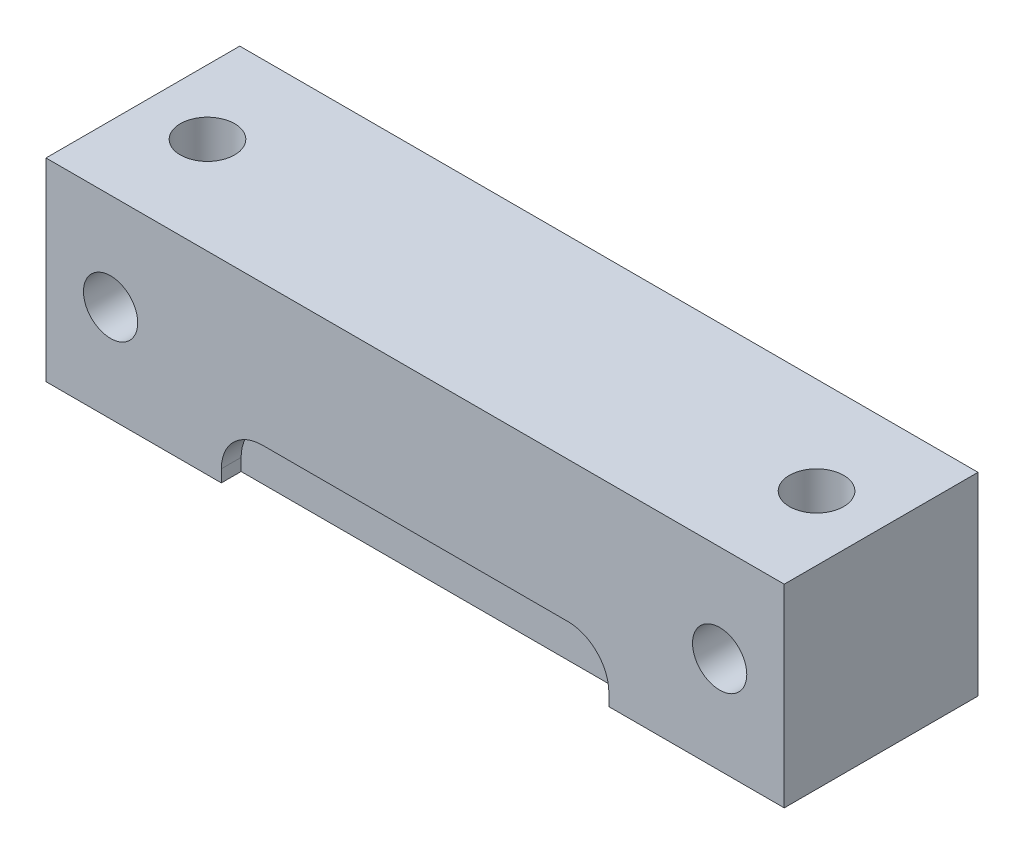
ISO-10303-21;
HEADER;
FILE_DESCRIPTION(('STEP AP214'),'2;1');
FILE_NAME('part.step','',(''),(''),'','','');
FILE_SCHEMA(('AUTOMOTIVE_DESIGN { 1 0 10303 214 1 1 1 1 }'));
ENDSEC;
DATA;
#1=APPLICATION_CONTEXT('core data for automotive mechanical design processes');
#2=APPLICATION_PROTOCOL_DEFINITION('international standard','automotive_design',2000,#1);
#3=PRODUCT_CONTEXT('',#1,'mechanical');
#4=PRODUCT('Part','Part','',(#3));
#5=PRODUCT_RELATED_PRODUCT_CATEGORY('part','',(#4));
#6=PRODUCT_DEFINITION_FORMATION('','',#4);
#7=PRODUCT_DEFINITION_CONTEXT('part definition',#1,'design');
#8=PRODUCT_DEFINITION('design','',#6,#7);
#9=PRODUCT_DEFINITION_SHAPE('','',#8);
#10=(LENGTH_UNIT() NAMED_UNIT(*) SI_UNIT(.MILLI.,.METRE.));
#11=(NAMED_UNIT(*) PLANE_ANGLE_UNIT() SI_UNIT($,.RADIAN.));
#12=(NAMED_UNIT(*) SI_UNIT($,.STERADIAN.) SOLID_ANGLE_UNIT());
#13=UNCERTAINTY_MEASURE_WITH_UNIT(LENGTH_MEASURE(1.E-05),#10,'distance_accuracy_value','');
#14=(GEOMETRIC_REPRESENTATION_CONTEXT(3) GLOBAL_UNCERTAINTY_ASSIGNED_CONTEXT((#13)) GLOBAL_UNIT_ASSIGNED_CONTEXT((#10,
#11,#12)) REPRESENTATION_CONTEXT('',''));
#15=CARTESIAN_POINT('',(0.,0.,0.));
#16=DIRECTION('',(0.,0.,1.));
#17=DIRECTION('',(1.,0.,0.));
#18=AXIS2_PLACEMENT_3D('',#15,#16,#17);
#19=CARTESIAN_POINT('',(5.,0.,7.5));
#20=DIRECTION('',(0.,0.,1.));
#21=DIRECTION('',(1.,0.,0.));
#22=AXIS2_PLACEMENT_3D('',#19,#20,#21);
#23=CYLINDRICAL_SURFACE('',#22,2.09999999999999);
#24=CARTESIAN_POINT('',(5.,0.,7.5));
#25=DIRECTION('',(0.,0.,1.));
#26=DIRECTION('',(1.,0.,0.));
#27=AXIS2_PLACEMENT_3D('',#24,#25,#26);
#28=CIRCLE('',#27,2.09999999999999);
#29=CARTESIAN_POINT('',(7.09999999999998,0.,7.5));
#30=VERTEX_POINT('',#29);
#31=EDGE_CURVE('E236',#30,#30,#28,.T.);
#32=ORIENTED_EDGE('',*,*,#31,.T.);
#33=EDGE_LOOP('',(#32));
#34=FACE_BOUND('',#33,.T.);
#35=CARTESIAN_POINT('',(5.,0.,0.));
#36=DIRECTION('',(0.,0.707106781186547,0.707106781186547));
#37=DIRECTION('',(0.,-0.707106781186547,0.707106781186547));
#38=AXIS2_PLACEMENT_3D('',#35,#36,#37);
#39=ELLIPSE('',#38,2.96984848098349,2.09999999999999);
#40=CARTESIAN_POINT('',(7.09999999999999,0.,0.));
#41=VERTEX_POINT('',#40);
#42=CARTESIAN_POINT('',(2.90000000000001,0.,0.));
#43=VERTEX_POINT('',#42);
#44=EDGE_CURVE('E185',#41,#43,#39,.F.);
#45=ORIENTED_EDGE('',*,*,#44,.T.);
#46=CARTESIAN_POINT('',(5.,0.,0.));
#47=DIRECTION('',(0.,-0.707106781186547,0.707106781186547));
#48=DIRECTION('',(0.,0.707106781186547,0.707106781186547));
#49=AXIS2_PLACEMENT_3D('',#46,#47,#48);
#50=ELLIPSE('',#49,2.96984848098349,2.09999999999999);
#51=EDGE_CURVE('E193',#43,#41,#50,.F.);
#52=ORIENTED_EDGE('',*,*,#51,.T.);
#53=EDGE_LOOP('',(#45,#52));
#54=FACE_BOUND('',#53,.T.);
#55=ADVANCED_FACE('F46',(#34,#54),#23,.F.);
#56=CARTESIAN_POINT('',(52.15,0.,7.5));
#57=DIRECTION('',(0.,0.,1.));
#58=DIRECTION('',(1.,0.,0.));
#59=AXIS2_PLACEMENT_3D('',#56,#57,#58);
#60=CYLINDRICAL_SURFACE('',#59,2.09999999999999);
#61=CARTESIAN_POINT('',(52.15,0.,7.5));
#62=DIRECTION('',(0.,0.,1.));
#63=DIRECTION('',(1.,0.,0.));
#64=AXIS2_PLACEMENT_3D('',#61,#62,#63);
#65=CIRCLE('',#64,2.09999999999999);
#66=CARTESIAN_POINT('',(54.25,0.,7.5));
#67=VERTEX_POINT('',#66);
#68=EDGE_CURVE('E242',#67,#67,#65,.T.);
#69=ORIENTED_EDGE('',*,*,#68,.T.);
#70=EDGE_LOOP('',(#69));
#71=FACE_BOUND('',#70,.T.);
#72=CARTESIAN_POINT('',(52.15,0.,0.));
#73=DIRECTION('',(0.,0.707106781186547,0.707106781186547));
#74=DIRECTION('',(0.,-0.707106781186547,0.707106781186547));
#75=AXIS2_PLACEMENT_3D('',#72,#73,#74);
#76=ELLIPSE('',#75,2.96984848098349,2.09999999999999);
#77=CARTESIAN_POINT('',(54.25,0.,0.));
#78=VERTEX_POINT('',#77);
#79=CARTESIAN_POINT('',(50.05,0.,0.));
#80=VERTEX_POINT('',#79);
#81=EDGE_CURVE('E174',#78,#80,#76,.F.);
#82=ORIENTED_EDGE('',*,*,#81,.T.);
#83=CARTESIAN_POINT('',(52.15,0.,0.));
#84=DIRECTION('',(0.,-0.707106781186547,0.707106781186547));
#85=DIRECTION('',(0.,0.707106781186547,0.707106781186547));
#86=AXIS2_PLACEMENT_3D('',#83,#84,#85);
#87=ELLIPSE('',#86,2.96984848098349,2.09999999999999);
#88=EDGE_CURVE('E182',#80,#78,#87,.F.);
#89=ORIENTED_EDGE('',*,*,#88,.T.);
#90=EDGE_LOOP('',(#82,#89));
#91=FACE_BOUND('',#90,.T.);
#92=ADVANCED_FACE('F289',(#71,#91),#60,.F.);
#93=CARTESIAN_POINT('',(57.15,-7.5,-7.5));
#94=DIRECTION('',(0.,0.,1.));
#95=DIRECTION('',(1.,0.,0.));
#96=AXIS2_PLACEMENT_3D('',#93,#94,#95);
#97=PLANE('',#96);
#98=CARTESIAN_POINT('',(5.,0.,-7.5));
#99=DIRECTION('',(0.,0.,1.));
#100=DIRECTION('',(1.,0.,0.));
#101=AXIS2_PLACEMENT_3D('',#98,#99,#100);
#102=CIRCLE('',#101,2.1);
#103=CARTESIAN_POINT('',(7.09999999999999,0.,-7.5));
#104=VERTEX_POINT('',#103);
#105=EDGE_CURVE('E239',#104,#104,#102,.T.);
#106=ORIENTED_EDGE('',*,*,#105,.T.);
#107=EDGE_LOOP('',(#106));
#108=FACE_BOUND('',#107,.T.);
#109=CARTESIAN_POINT('',(52.15,0.,-7.5));
#110=DIRECTION('',(0.,0.,1.));
#111=DIRECTION('',(1.,0.,0.));
#112=AXIS2_PLACEMENT_3D('',#109,#110,#111);
#113=CIRCLE('',#112,2.1);
#114=CARTESIAN_POINT('',(54.25,0.,-7.5));
#115=VERTEX_POINT('',#114);
#116=EDGE_CURVE('E245',#115,#115,#113,.T.);
#117=ORIENTED_EDGE('',*,*,#116,.T.);
#118=EDGE_LOOP('',(#117));
#119=FACE_BOUND('',#118,.T.);
#120=DIRECTION('',(0.,1.,0.));
#121=VECTOR('',#120,1.);
#122=CARTESIAN_POINT('',(0.,-7.5,-7.5));
#123=LINE('',#122,#121);
#124=CARTESIAN_POINT('',(0.,-7.5,-7.5));
#125=VERTEX_POINT('',#124);
#126=CARTESIAN_POINT('',(0.,7.5,-7.5));
#127=VERTEX_POINT('',#126);
#128=EDGE_CURVE('E248',#125,#127,#123,.T.);
#129=ORIENTED_EDGE('',*,*,#128,.T.);
#130=DIRECTION('',(-1.,0.,0.));
#131=VECTOR('',#130,1.);
#132=CARTESIAN_POINT('',(57.15,7.5,-7.5));
#133=LINE('',#132,#131);
#134=CARTESIAN_POINT('',(57.15,7.5,-7.5));
#135=VERTEX_POINT('',#134);
#136=EDGE_CURVE('E166',#135,#127,#133,.T.);
#137=ORIENTED_EDGE('',*,*,#136,.F.);
#138=DIRECTION('',(0.,1.,0.));
#139=VECTOR('',#138,1.);
#140=CARTESIAN_POINT('',(57.15,-7.5,-7.5));
#141=LINE('',#140,#139);
#142=CARTESIAN_POINT('',(57.15,-7.5,-7.5));
#143=VERTEX_POINT('',#142);
#144=EDGE_CURVE('E249',#143,#135,#141,.T.);
#145=ORIENTED_EDGE('',*,*,#144,.F.);
#146=DIRECTION('',(-1.,0.,0.));
#147=VECTOR('',#146,1.);
#148=CARTESIAN_POINT('',(57.15,-7.5,-7.5));
#149=LINE('',#148,#147);
#150=EDGE_CURVE('E168',#143,#125,#149,.T.);
#151=ORIENTED_EDGE('',*,*,#150,.T.);
#152=EDGE_LOOP('',(#129,#137,#145,#151));
#153=FACE_BOUND('',#152,.T.);
#154=ADVANCED_FACE('F270',(#108,#119,#153),#97,.F.);
#155=CARTESIAN_POINT('',(57.15,7.5,7.5));
#156=DIRECTION('',(0.,-1.,0.));
#157=DIRECTION('',(0.,0.,-1.));
#158=AXIS2_PLACEMENT_3D('',#155,#156,#157);
#159=PLANE('',#158);
#160=CARTESIAN_POINT('',(5.,7.5,0.));
#161=DIRECTION('',(0.,-1.,0.));
#162=DIRECTION('',(0.,0.,-1.));
#163=AXIS2_PLACEMENT_3D('',#160,#161,#162);
#164=CIRCLE('',#163,2.1);
#165=CARTESIAN_POINT('',(5.,7.5,-2.1));
#166=VERTEX_POINT('',#165);
#167=EDGE_CURVE('E227',#166,#166,#164,.T.);
#168=ORIENTED_EDGE('',*,*,#167,.T.);
#169=EDGE_LOOP('',(#168));
#170=FACE_BOUND('',#169,.T.);
#171=CARTESIAN_POINT('',(52.15,7.5,0.));
#172=DIRECTION('',(0.,-1.,0.));
#173=DIRECTION('',(0.,0.,-1.));
#174=AXIS2_PLACEMENT_3D('',#171,#172,#173);
#175=CIRCLE('',#174,2.1);
#176=CARTESIAN_POINT('',(52.15,7.5,-2.1));
#177=VERTEX_POINT('',#176);
#178=EDGE_CURVE('E233',#177,#177,#175,.T.);
#179=ORIENTED_EDGE('',*,*,#178,.T.);
#180=EDGE_LOOP('',(#179));
#181=FACE_BOUND('',#180,.T.);
#182=DIRECTION('',(0.,0.,1.));
#183=VECTOR('',#182,1.);
#184=CARTESIAN_POINT('',(0.,7.5,7.5));
#185=LINE('',#184,#183);
#186=CARTESIAN_POINT('',(0.,7.5,7.5));
#187=VERTEX_POINT('',#186);
#188=EDGE_CURVE('E260',#127,#187,#185,.T.);
#189=ORIENTED_EDGE('',*,*,#188,.T.);
#190=DIRECTION('',(-1.,0.,0.));
#191=VECTOR('',#190,1.);
#192=CARTESIAN_POINT('',(57.15,7.5,7.5));
#193=LINE('',#192,#191);
#194=CARTESIAN_POINT('',(57.15,7.5,7.5));
#195=VERTEX_POINT('',#194);
#196=EDGE_CURVE('E162',#195,#187,#193,.T.);
#197=ORIENTED_EDGE('',*,*,#196,.F.);
#198=DIRECTION('',(0.,0.,1.));
#199=VECTOR('',#198,1.);
#200=CARTESIAN_POINT('',(57.15,7.5,7.5));
#201=LINE('',#200,#199);
#202=EDGE_CURVE('E252',#135,#195,#201,.T.);
#203=ORIENTED_EDGE('',*,*,#202,.F.);
#204=ORIENTED_EDGE('',*,*,#136,.T.);
#205=EDGE_LOOP('',(#189,#197,#203,#204));
#206=FACE_BOUND('',#205,.T.);
#207=ADVANCED_FACE('F275',(#170,#181,#206),#159,.F.);
#208=CARTESIAN_POINT('',(57.15,-7.5,7.5));
#209=DIRECTION('',(0.,0.,-1.));
#210=DIRECTION('',(-1.,0.,0.));
#211=AXIS2_PLACEMENT_3D('',#208,#209,#210);
#212=PLANE('',#211);
#213=ORIENTED_EDGE('',*,*,#31,.F.);
#214=EDGE_LOOP('',(#213));
#215=FACE_BOUND('',#214,.T.);
#216=ORIENTED_EDGE('',*,*,#68,.F.);
#217=EDGE_LOOP('',(#216));
#218=FACE_BOUND('',#217,.T.);
#219=DIRECTION('',(-1.,0.,0.));
#220=VECTOR('',#219,1.);
#221=CARTESIAN_POINT('',(13.575,-3.37689826702698,7.5));
#222=LINE('',#221,#220);
#223=CARTESIAN_POINT('',(40.4,-3.37689826702698,7.5));
#224=VERTEX_POINT('',#223);
#225=CARTESIAN_POINT('',(16.75,-3.37689826702698,7.5));
#226=VERTEX_POINT('',#225);
#227=EDGE_CURVE('E156',#224,#226,#222,.T.);
#228=ORIENTED_EDGE('',*,*,#227,.F.);
#229=CARTESIAN_POINT('',(40.4,-6.55189826702698,7.5));
#230=DIRECTION('',(0.,0.,-1.));
#231=DIRECTION('',(-1.,0.,0.));
#232=AXIS2_PLACEMENT_3D('',#229,#230,#231);
#233=CIRCLE('',#232,3.175);
#234=CARTESIAN_POINT('',(43.575,-6.55189826702698,7.5));
#235=VERTEX_POINT('',#234);
#236=EDGE_CURVE('E54',#224,#235,#233,.T.);
#237=ORIENTED_EDGE('',*,*,#236,.T.);
#238=DIRECTION('',(0.,1.,0.));
#239=VECTOR('',#238,1.);
#240=CARTESIAN_POINT('',(43.575,-11.623101732973,7.5));
#241=LINE('',#240,#239);
#242=CARTESIAN_POINT('',(43.575,-7.5,7.5));
#243=VERTEX_POINT('',#242);
#244=EDGE_CURVE('E139',#243,#235,#241,.T.);
#245=ORIENTED_EDGE('',*,*,#244,.F.);
#246=DIRECTION('',(-1.,0.,0.));
#247=VECTOR('',#246,1.);
#248=CARTESIAN_POINT('',(57.15,-7.5,7.5));
#249=LINE('',#248,#247);
#250=CARTESIAN_POINT('',(57.15,-7.5,7.5));
#251=VERTEX_POINT('',#250);
#252=EDGE_CURVE('E154',#251,#243,#249,.T.);
#253=ORIENTED_EDGE('',*,*,#252,.F.);
#254=DIRECTION('',(0.,-1.,0.));
#255=VECTOR('',#254,1.);
#256=CARTESIAN_POINT('',(57.15,-7.5,7.5));
#257=LINE('',#256,#255);
#258=EDGE_CURVE('E255',#195,#251,#257,.T.);
#259=ORIENTED_EDGE('',*,*,#258,.F.);
#260=ORIENTED_EDGE('',*,*,#196,.T.);
#261=DIRECTION('',(0.,-1.,0.));
#262=VECTOR('',#261,1.);
#263=CARTESIAN_POINT('',(0.,-7.5,7.5));
#264=LINE('',#263,#262);
#265=CARTESIAN_POINT('',(0.,-7.5,7.5));
#266=VERTEX_POINT('',#265);
#267=EDGE_CURVE('E262',#187,#266,#264,.T.);
#268=ORIENTED_EDGE('',*,*,#267,.T.);
#269=CARTESIAN_POINT('',(13.575,-7.5,7.5));
#270=VERTEX_POINT('',#269);
#271=EDGE_CURVE('E163',#270,#266,#249,.T.);
#272=ORIENTED_EDGE('',*,*,#271,.F.);
#273=DIRECTION('',(0.,-1.,0.));
#274=VECTOR('',#273,1.);
#275=CARTESIAN_POINT('',(13.575,-11.623101732973,7.5));
#276=LINE('',#275,#274);
#277=CARTESIAN_POINT('',(13.575,-6.55189826702698,7.5));
#278=VERTEX_POINT('',#277);
#279=EDGE_CURVE('E214',#278,#270,#276,.T.);
#280=ORIENTED_EDGE('',*,*,#279,.F.);
#281=CARTESIAN_POINT('',(16.75,-6.55189826702698,7.5));
#282=DIRECTION('',(0.,0.,-1.));
#283=DIRECTION('',(-1.,0.,0.));
#284=AXIS2_PLACEMENT_3D('',#281,#282,#283);
#285=CIRCLE('',#284,3.175);
#286=EDGE_CURVE('E13',#278,#226,#285,.T.);
#287=ORIENTED_EDGE('',*,*,#286,.T.);
#288=EDGE_LOOP('',(#228,#237,#245,#253,#259,#260,#268,#272,#280,#287));
#289=FACE_BOUND('',#288,.T.);
#290=ADVANCED_FACE('F152',(#215,#218,#289),#212,.F.);
#291=CARTESIAN_POINT('',(57.15,-7.5,7.5));
#292=DIRECTION('',(0.,1.,0.));
#293=DIRECTION('',(0.,0.,1.));
#294=AXIS2_PLACEMENT_3D('',#291,#292,#293);
#295=PLANE('',#294);
#296=ORIENTED_EDGE('',*,*,#252,.T.);
#297=DIRECTION('',(0.,0.,-1.));
#298=VECTOR('',#297,1.);
#299=CARTESIAN_POINT('',(43.575,-7.5,7.5));
#300=LINE('',#299,#298);
#301=CARTESIAN_POINT('',(43.575,-7.5,5.97));
#302=VERTEX_POINT('',#301);
#303=EDGE_CURVE('E136',#243,#302,#300,.T.);
#304=ORIENTED_EDGE('',*,*,#303,.T.);
#305=DIRECTION('',(-1.,0.,0.));
#306=VECTOR('',#305,1.);
#307=CARTESIAN_POINT('',(57.15,-7.5,5.97));
#308=LINE('',#307,#306);
#309=CARTESIAN_POINT('',(13.575,-7.5,5.97));
#310=VERTEX_POINT('',#309);
#311=EDGE_CURVE('E196',#302,#310,#308,.T.);
#312=ORIENTED_EDGE('',*,*,#311,.T.);
#313=DIRECTION('',(0.,0.,1.));
#314=VECTOR('',#313,1.);
#315=CARTESIAN_POINT('',(13.575,-7.5,7.5));
#316=LINE('',#315,#314);
#317=EDGE_CURVE('E147',#310,#270,#316,.T.);
#318=ORIENTED_EDGE('',*,*,#317,.T.);
#319=ORIENTED_EDGE('',*,*,#271,.T.);
#320=DIRECTION('',(0.,0.,-1.));
#321=VECTOR('',#320,1.);
#322=CARTESIAN_POINT('',(0.,-7.5,7.5));
#323=LINE('',#322,#321);
#324=EDGE_CURVE('E253',#266,#125,#323,.T.);
#325=ORIENTED_EDGE('',*,*,#324,.T.);
#326=ORIENTED_EDGE('',*,*,#150,.F.);
#327=DIRECTION('',(0.,0.,-1.));
#328=VECTOR('',#327,1.);
#329=CARTESIAN_POINT('',(57.15,-7.5,7.5));
#330=LINE('',#329,#328);
#331=EDGE_CURVE('E161',#251,#143,#330,.T.);
#332=ORIENTED_EDGE('',*,*,#331,.F.);
#333=EDGE_LOOP('',(#296,#304,#312,#318,#319,#325,#326,#332));
#334=FACE_BOUND('',#333,.T.);
#335=CARTESIAN_POINT('',(5.,-7.5,0.));
#336=DIRECTION('',(0.,-1.,0.));
#337=DIRECTION('',(0.,0.,-1.));
#338=AXIS2_PLACEMENT_3D('',#335,#336,#337);
#339=CIRCLE('',#338,2.09999999999999);
#340=CARTESIAN_POINT('',(5.,-7.5,-2.09999999999999));
#341=VERTEX_POINT('',#340);
#342=EDGE_CURVE('E224',#341,#341,#339,.T.);
#343=ORIENTED_EDGE('',*,*,#342,.F.);
#344=EDGE_LOOP('',(#343));
#345=FACE_BOUND('',#344,.T.);
#346=CARTESIAN_POINT('',(52.15,-7.5,0.));
#347=DIRECTION('',(0.,-1.,0.));
#348=DIRECTION('',(0.,0.,-1.));
#349=AXIS2_PLACEMENT_3D('',#346,#347,#348);
#350=CIRCLE('',#349,2.09999999999999);
#351=CARTESIAN_POINT('',(52.15,-7.5,-2.09999999999999));
#352=VERTEX_POINT('',#351);
#353=EDGE_CURVE('E230',#352,#352,#350,.T.);
#354=ORIENTED_EDGE('',*,*,#353,.F.);
#355=EDGE_LOOP('',(#354));
#356=FACE_BOUND('',#355,.T.);
#357=ADVANCED_FACE('F158',(#334,#345,#356),#295,.F.);
#358=CARTESIAN_POINT('',(57.15,0.,0.));
#359=DIRECTION('',(-1.,0.,0.));
#360=DIRECTION('',(0.,0.,1.));
#361=AXIS2_PLACEMENT_3D('',#358,#359,#360);
#362=PLANE('',#361);
#363=ORIENTED_EDGE('',*,*,#144,.T.);
#364=ORIENTED_EDGE('',*,*,#202,.T.);
#365=ORIENTED_EDGE('',*,*,#258,.T.);
#366=ORIENTED_EDGE('',*,*,#331,.T.);
#367=EDGE_LOOP('',(#363,#364,#365,#366));
#368=FACE_BOUND('',#367,.T.);
#369=ADVANCED_FACE('F277',(#368),#362,.F.);
#370=CARTESIAN_POINT('',(0.,0.,0.));
#371=DIRECTION('',(-1.,0.,0.));
#372=DIRECTION('',(0.,0.,1.));
#373=AXIS2_PLACEMENT_3D('',#370,#371,#372);
#374=PLANE('',#373);
#375=ORIENTED_EDGE('',*,*,#128,.F.);
#376=ORIENTED_EDGE('',*,*,#324,.F.);
#377=ORIENTED_EDGE('',*,*,#267,.F.);
#378=ORIENTED_EDGE('',*,*,#188,.F.);
#379=EDGE_LOOP('',(#375,#376,#377,#378));
#380=FACE_BOUND('',#379,.T.);
#381=ADVANCED_FACE('F272',(#380),#374,.T.);
#382=CARTESIAN_POINT('',(52.15,0.,0.));
#383=DIRECTION('',(0.,0.707106781186547,0.707106781186547));
#384=DIRECTION('',(0.,-0.707106781186547,0.707106781186547));
#385=AXIS2_PLACEMENT_3D('',#382,#383,#384);
#386=ELLIPSE('',#385,2.96984848098349,2.09999999999999);
#387=EDGE_CURVE('E176',#78,#80,#386,.T.);
#388=ORIENTED_EDGE('',*,*,#387,.T.);
#389=CARTESIAN_POINT('',(52.15,0.,0.));
#390=DIRECTION('',(0.,-0.707106781186547,0.707106781186547));
#391=DIRECTION('',(0.,0.707106781186547,0.707106781186547));
#392=AXIS2_PLACEMENT_3D('',#389,#390,#391);
#393=ELLIPSE('',#392,2.96984848098349,2.09999999999999);
#394=EDGE_CURVE('E179',#80,#78,#393,.T.);
#395=ORIENTED_EDGE('',*,*,#394,.T.);
#396=EDGE_LOOP('',(#388,#395));
#397=FACE_BOUND('',#396,.T.);
#398=ORIENTED_EDGE('',*,*,#116,.F.);
#399=EDGE_LOOP('',(#398));
#400=FACE_BOUND('',#399,.T.);
#401=ADVANCED_FACE('F284',(#397,#400),#60,.F.);
#402=CARTESIAN_POINT('',(5.,0.,0.));
#403=DIRECTION('',(0.,0.707106781186547,0.707106781186547));
#404=DIRECTION('',(0.,-0.707106781186547,0.707106781186547));
#405=AXIS2_PLACEMENT_3D('',#402,#403,#404);
#406=ELLIPSE('',#405,2.96984848098349,2.09999999999999);
#407=EDGE_CURVE('E187',#41,#43,#406,.T.);
#408=ORIENTED_EDGE('',*,*,#407,.T.);
#409=CARTESIAN_POINT('',(5.,0.,0.));
#410=DIRECTION('',(0.,-0.707106781186547,0.707106781186547));
#411=DIRECTION('',(0.,0.707106781186547,0.707106781186547));
#412=AXIS2_PLACEMENT_3D('',#409,#410,#411);
#413=ELLIPSE('',#412,2.96984848098349,2.09999999999999);
#414=EDGE_CURVE('E190',#43,#41,#413,.T.);
#415=ORIENTED_EDGE('',*,*,#414,.T.);
#416=EDGE_LOOP('',(#408,#415));
#417=FACE_BOUND('',#416,.T.);
#418=ORIENTED_EDGE('',*,*,#105,.F.);
#419=EDGE_LOOP('',(#418));
#420=FACE_BOUND('',#419,.T.);
#421=ADVANCED_FACE('F292',(#417,#420),#23,.F.);
#422=CARTESIAN_POINT('',(52.15,-7.5,0.));
#423=DIRECTION('',(0.,-1.,0.));
#424=DIRECTION('',(0.,0.,-1.));
#425=AXIS2_PLACEMENT_3D('',#422,#423,#424);
#426=CYLINDRICAL_SURFACE('',#425,2.09999999999999);
#427=ORIENTED_EDGE('',*,*,#353,.T.);
#428=EDGE_LOOP('',(#427));
#429=FACE_BOUND('',#428,.T.);
#430=ORIENTED_EDGE('',*,*,#81,.F.);
#431=ORIENTED_EDGE('',*,*,#394,.F.);
#432=EDGE_LOOP('',(#430,#431));
#433=FACE_BOUND('',#432,.T.);
#434=ADVANCED_FACE('F300',(#429,#433),#426,.F.);
#435=ORIENTED_EDGE('',*,*,#178,.F.);
#436=EDGE_LOOP('',(#435));
#437=FACE_BOUND('',#436,.T.);
#438=ORIENTED_EDGE('',*,*,#387,.F.);
#439=ORIENTED_EDGE('',*,*,#88,.F.);
#440=EDGE_LOOP('',(#438,#439));
#441=FACE_BOUND('',#440,.T.);
#442=ADVANCED_FACE('F306',(#437,#441),#426,.F.);
#443=CARTESIAN_POINT('',(5.,-7.5,0.));
#444=DIRECTION('',(0.,-1.,0.));
#445=DIRECTION('',(0.,0.,-1.));
#446=AXIS2_PLACEMENT_3D('',#443,#444,#445);
#447=CYLINDRICAL_SURFACE('',#446,2.09999999999999);
#448=ORIENTED_EDGE('',*,*,#342,.T.);
#449=EDGE_LOOP('',(#448));
#450=FACE_BOUND('',#449,.T.);
#451=ORIENTED_EDGE('',*,*,#44,.F.);
#452=ORIENTED_EDGE('',*,*,#414,.F.);
#453=EDGE_LOOP('',(#451,#452));
#454=FACE_BOUND('',#453,.T.);
#455=ADVANCED_FACE('F350',(#450,#454),#447,.F.);
#456=ORIENTED_EDGE('',*,*,#167,.F.);
#457=EDGE_LOOP('',(#456));
#458=FACE_BOUND('',#457,.T.);
#459=ORIENTED_EDGE('',*,*,#407,.F.);
#460=ORIENTED_EDGE('',*,*,#51,.F.);
#461=EDGE_LOOP('',(#459,#460));
#462=FACE_BOUND('',#461,.T.);
#463=ADVANCED_FACE('F348',(#458,#462),#447,.F.);
#464=CARTESIAN_POINT('',(43.575,-11.623101732973,5.97));
#465=DIRECTION('',(1.,0.,0.));
#466=DIRECTION('',(0.,0.,-1.));
#467=AXIS2_PLACEMENT_3D('',#464,#465,#466);
#468=PLANE('',#467);
#469=ORIENTED_EDGE('',*,*,#244,.T.);
#470=DIRECTION('',(0.,0.,1.));
#471=VECTOR('',#470,1.);
#472=CARTESIAN_POINT('',(43.575,-6.55189826702698,5.97));
#473=LINE('',#472,#471);
#474=CARTESIAN_POINT('',(43.575,-6.55189826702698,5.97));
#475=VERTEX_POINT('',#474);
#476=EDGE_CURVE('E204',#235,#475,#473,.F.);
#477=ORIENTED_EDGE('',*,*,#476,.T.);
#478=DIRECTION('',(0.,1.,0.));
#479=VECTOR('',#478,1.);
#480=CARTESIAN_POINT('',(43.575,-11.623101732973,5.97));
#481=LINE('',#480,#479);
#482=EDGE_CURVE('E142',#302,#475,#481,.T.);
#483=ORIENTED_EDGE('',*,*,#482,.F.);
#484=ORIENTED_EDGE('',*,*,#303,.F.);
#485=EDGE_LOOP('',(#469,#477,#483,#484));
#486=FACE_BOUND('',#485,.T.);
#487=ADVANCED_FACE('F138',(#486),#468,.F.);
#488=CARTESIAN_POINT('',(13.575,-11.623101732973,5.97));
#489=DIRECTION('',(-1.,0.,0.));
#490=DIRECTION('',(0.,0.,1.));
#491=AXIS2_PLACEMENT_3D('',#488,#489,#490);
#492=PLANE('',#491);
#493=DIRECTION('',(0.,-1.,0.));
#494=VECTOR('',#493,1.);
#495=CARTESIAN_POINT('',(13.575,-11.623101732973,5.97));
#496=LINE('',#495,#494);
#497=CARTESIAN_POINT('',(13.575,-6.55189826702698,5.97));
#498=VERTEX_POINT('',#497);
#499=EDGE_CURVE('E215',#498,#310,#496,.T.);
#500=ORIENTED_EDGE('',*,*,#499,.F.);
#501=DIRECTION('',(0.,0.,1.));
#502=VECTOR('',#501,1.);
#503=CARTESIAN_POINT('',(13.575,-6.55189826702698,7.5));
#504=LINE('',#503,#502);
#505=EDGE_CURVE('E209',#498,#278,#504,.T.);
#506=ORIENTED_EDGE('',*,*,#505,.T.);
#507=ORIENTED_EDGE('',*,*,#279,.T.);
#508=ORIENTED_EDGE('',*,*,#317,.F.);
#509=EDGE_LOOP('',(#500,#506,#507,#508));
#510=FACE_BOUND('',#509,.T.);
#511=ADVANCED_FACE('F212',(#510),#492,.F.);
#512=CARTESIAN_POINT('',(0.,0.,5.97));
#513=DIRECTION('',(0.,0.,-1.));
#514=DIRECTION('',(-1.,0.,0.));
#515=AXIS2_PLACEMENT_3D('',#512,#513,#514);
#516=PLANE('',#515);
#517=ORIENTED_EDGE('',*,*,#482,.T.);
#518=CARTESIAN_POINT('',(40.4,-6.55189826702698,5.97));
#519=DIRECTION('',(0.,0.,-1.));
#520=DIRECTION('',(-1.,0.,0.));
#521=AXIS2_PLACEMENT_3D('',#518,#519,#520);
#522=CIRCLE('',#521,3.175);
#523=CARTESIAN_POINT('',(40.4,-3.37689826702698,5.97));
#524=VERTEX_POINT('',#523);
#525=EDGE_CURVE('E207',#475,#524,#522,.F.);
#526=ORIENTED_EDGE('',*,*,#525,.T.);
#527=DIRECTION('',(-1.,0.,0.));
#528=VECTOR('',#527,1.);
#529=CARTESIAN_POINT('',(13.575,-3.37689826702698,5.97));
#530=LINE('',#529,#528);
#531=CARTESIAN_POINT('',(16.75,-3.37689826702698,5.97));
#532=VERTEX_POINT('',#531);
#533=EDGE_CURVE('E220',#524,#532,#530,.T.);
#534=ORIENTED_EDGE('',*,*,#533,.T.);
#535=CARTESIAN_POINT('',(16.75,-6.55189826702698,5.97));
#536=DIRECTION('',(0.,0.,-1.));
#537=DIRECTION('',(-1.,0.,0.));
#538=AXIS2_PLACEMENT_3D('',#535,#536,#537);
#539=CIRCLE('',#538,3.175);
#540=EDGE_CURVE('E67',#532,#498,#539,.F.);
#541=ORIENTED_EDGE('',*,*,#540,.T.);
#542=ORIENTED_EDGE('',*,*,#499,.T.);
#543=ORIENTED_EDGE('',*,*,#311,.F.);
#544=EDGE_LOOP('',(#517,#526,#534,#541,#542,#543));
#545=FACE_BOUND('',#544,.T.);
#546=ADVANCED_FACE('F331',(#545),#516,.F.);
#547=CARTESIAN_POINT('',(13.575,-3.37689826702698,5.97));
#548=DIRECTION('',(0.,1.,0.));
#549=DIRECTION('',(0.,0.,1.));
#550=AXIS2_PLACEMENT_3D('',#547,#548,#549);
#551=PLANE('',#550);
#552=ORIENTED_EDGE('',*,*,#533,.F.);
#553=DIRECTION('',(0.,0.,1.));
#554=VECTOR('',#553,1.);
#555=CARTESIAN_POINT('',(40.4,-3.37689826702698,7.5));
#556=LINE('',#555,#554);
#557=EDGE_CURVE('E201',#524,#224,#556,.T.);
#558=ORIENTED_EDGE('',*,*,#557,.T.);
#559=ORIENTED_EDGE('',*,*,#227,.T.);
#560=DIRECTION('',(0.,0.,1.));
#561=VECTOR('',#560,1.);
#562=CARTESIAN_POINT('',(16.75,-3.37689826702698,5.97));
#563=LINE('',#562,#561);
#564=EDGE_CURVE('E146',#226,#532,#563,.F.);
#565=ORIENTED_EDGE('',*,*,#564,.T.);
#566=EDGE_LOOP('',(#552,#558,#559,#565));
#567=FACE_BOUND('',#566,.T.);
#568=ADVANCED_FACE('F325',(#567),#551,.F.);
#569=CARTESIAN_POINT('',(40.4,-6.55189826702698,5.97));
#570=DIRECTION('',(0.,0.,-1.));
#571=DIRECTION('',(-1.,0.,0.));
#572=AXIS2_PLACEMENT_3D('',#569,#570,#571);
#573=CYLINDRICAL_SURFACE('',#572,3.175);
#574=ORIENTED_EDGE('',*,*,#525,.F.);
#575=ORIENTED_EDGE('',*,*,#476,.F.);
#576=ORIENTED_EDGE('',*,*,#236,.F.);
#577=ORIENTED_EDGE('',*,*,#557,.F.);
#578=EDGE_LOOP('',(#574,#575,#576,#577));
#579=FACE_BOUND('',#578,.T.);
#580=ADVANCED_FACE('F323',(#579),#573,.F.);
#581=CARTESIAN_POINT('',(16.75,-6.55189826702698,5.97));
#582=DIRECTION('',(0.,0.,-1.));
#583=DIRECTION('',(-1.,0.,0.));
#584=AXIS2_PLACEMENT_3D('',#581,#582,#583);
#585=CYLINDRICAL_SURFACE('',#584,3.175);
#586=ORIENTED_EDGE('',*,*,#540,.F.);
#587=ORIENTED_EDGE('',*,*,#564,.F.);
#588=ORIENTED_EDGE('',*,*,#286,.F.);
#589=ORIENTED_EDGE('',*,*,#505,.F.);
#590=EDGE_LOOP('',(#586,#587,#588,#589));
#591=FACE_BOUND('',#590,.T.);
#592=ADVANCED_FACE('F48',(#591),#585,.F.);
#593=CLOSED_SHELL('',(#55,#92,#154,#207,#290,#357,#369,#381,#401,#421,#434,#442,#455,#463,#487,
#511,#546,#568,#580,#592));
#594=MANIFOLD_SOLID_BREP('B2',#593);
#595=ADVANCED_BREP_SHAPE_REPRESENTATION('',(#18,#594),#14);
#596=SHAPE_DEFINITION_REPRESENTATION(#9,#595);
ENDSEC;
END-ISO-10303-21;
